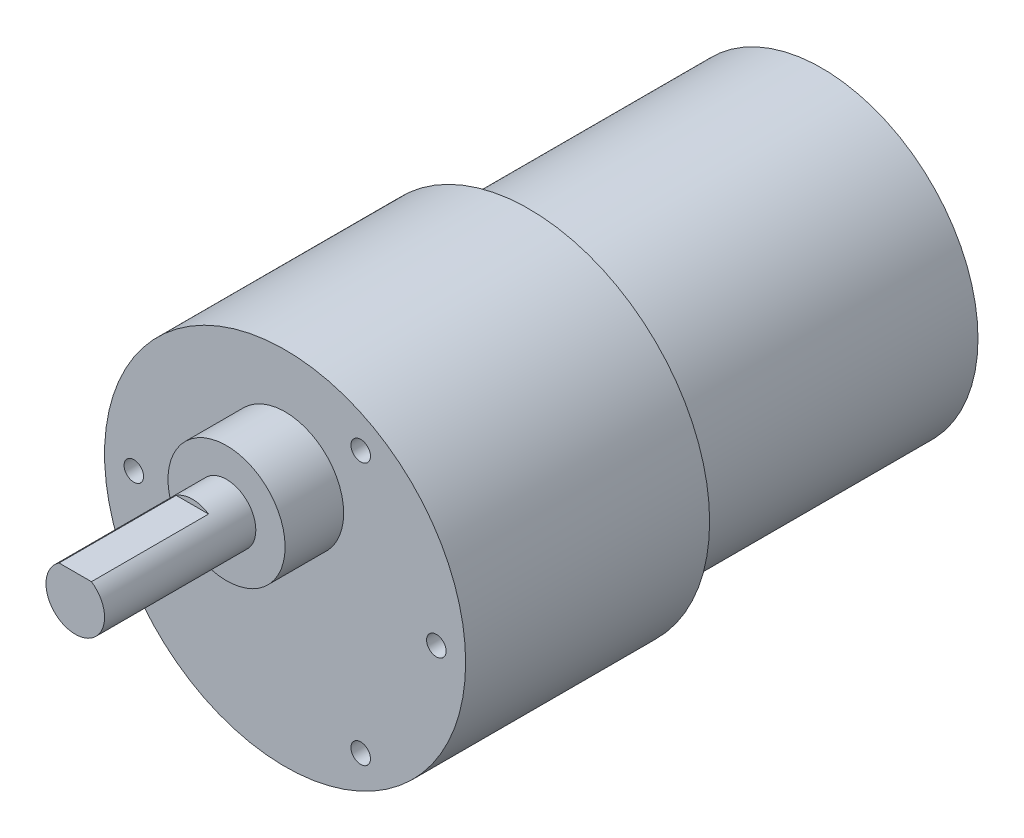
ISO-10303-21;
HEADER;
FILE_DESCRIPTION(('STEP AP214'),'2;1');
FILE_NAME('part.step','',(''),(''),'','','');
FILE_SCHEMA(('AUTOMOTIVE_DESIGN { 1 0 10303 214 1 1 1 1 }'));
ENDSEC;
DATA;
#1=APPLICATION_CONTEXT('core data for automotive mechanical design processes');
#2=APPLICATION_PROTOCOL_DEFINITION('international standard','automotive_design',2000,#1);
#3=PRODUCT_CONTEXT('',#1,'mechanical');
#4=PRODUCT('Part','Part','',(#3));
#5=PRODUCT_RELATED_PRODUCT_CATEGORY('part','',(#4));
#6=PRODUCT_DEFINITION_FORMATION('','',#4);
#7=PRODUCT_DEFINITION_CONTEXT('part definition',#1,'design');
#8=PRODUCT_DEFINITION('design','',#6,#7);
#9=PRODUCT_DEFINITION_SHAPE('','',#8);
#10=(LENGTH_UNIT() NAMED_UNIT(*) SI_UNIT(.MILLI.,.METRE.));
#11=(NAMED_UNIT(*) PLANE_ANGLE_UNIT() SI_UNIT($,.RADIAN.));
#12=(NAMED_UNIT(*) SI_UNIT($,.STERADIAN.) SOLID_ANGLE_UNIT());
#13=UNCERTAINTY_MEASURE_WITH_UNIT(LENGTH_MEASURE(1.E-05),#10,'distance_accuracy_value','');
#14=(GEOMETRIC_REPRESENTATION_CONTEXT(3) GLOBAL_UNCERTAINTY_ASSIGNED_CONTEXT((#13)) GLOBAL_UNIT_ASSIGNED_CONTEXT((#10,
#11,#12)) REPRESENTATION_CONTEXT('',''));
#15=CARTESIAN_POINT('',(0.,0.,0.));
#16=DIRECTION('',(0.,0.,1.));
#17=DIRECTION('',(1.,0.,0.));
#18=AXIS2_PLACEMENT_3D('',#15,#16,#17);
#19=CARTESIAN_POINT('',(0.,7.,61.));
#20=DIRECTION('',(0.,0.,1.));
#21=DIRECTION('',(1.,0.,0.));
#22=AXIS2_PLACEMENT_3D('',#19,#20,#21);
#23=PLANE('',#22);
#24=CARTESIAN_POINT('',(0.,7.,61.));
#25=DIRECTION('',(0.,0.,1.));
#26=DIRECTION('',(1.,0.,0.));
#27=AXIS2_PLACEMENT_3D('',#24,#25,#26);
#28=CIRCLE('',#27,6.);
#29=CARTESIAN_POINT('',(6.,7.,61.));
#30=VERTEX_POINT('',#29);
#31=EDGE_CURVE('E76',#30,#30,#28,.T.);
#32=ORIENTED_EDGE('',*,*,#31,.T.);
#33=EDGE_LOOP('',(#32));
#34=FACE_BOUND('',#33,.T.);
#35=CARTESIAN_POINT('',(0.,7.,61.));
#36=DIRECTION('',(0.,0.,1.));
#37=DIRECTION('',(1.,0.,0.));
#38=AXIS2_PLACEMENT_3D('',#35,#36,#37);
#39=CIRCLE('',#38,3.);
#40=CARTESIAN_POINT('',(3.,7.,61.));
#41=VERTEX_POINT('',#40);
#42=EDGE_CURVE('E73',#41,#41,#39,.T.);
#43=ORIENTED_EDGE('',*,*,#42,.F.);
#44=EDGE_LOOP('',(#43));
#45=FACE_BOUND('',#44,.T.);
#46=ADVANCED_FACE('F34',(#34,#45),#23,.T.);
#47=CARTESIAN_POINT('',(0.,0.,55.));
#48=DIRECTION('',(0.,0.,1.));
#49=DIRECTION('',(1.,0.,0.));
#50=AXIS2_PLACEMENT_3D('',#47,#48,#49);
#51=PLANE('',#50);
#52=CARTESIAN_POINT('',(0.,0.,55.));
#53=DIRECTION('',(0.,0.,1.));
#54=DIRECTION('',(1.,0.,0.));
#55=AXIS2_PLACEMENT_3D('',#52,#53,#54);
#56=CIRCLE('',#55,18.5);
#57=CARTESIAN_POINT('',(18.5,0.,55.));
#58=VERTEX_POINT('',#57);
#59=EDGE_CURVE('E109',#58,#58,#56,.T.);
#60=ORIENTED_EDGE('',*,*,#59,.T.);
#61=EDGE_LOOP('',(#60));
#62=FACE_BOUND('',#61,.T.);
#63=CARTESIAN_POINT('',(-15.5,1.08235921504137E-13,55.));
#64=DIRECTION('',(0.,0.,1.));
#65=DIRECTION('',(-1.,0.,0.));
#66=AXIS2_PLACEMENT_3D('',#63,#64,#65);
#67=CIRCLE('',#66,0.999999999999476);
#68=CARTESIAN_POINT('',(-16.4999999999995,1.08235921504137E-13,55.));
#69=VERTEX_POINT('',#68);
#70=EDGE_CURVE('E100',#69,#69,#67,.T.);
#71=ORIENTED_EDGE('',*,*,#70,.F.);
#72=EDGE_LOOP('',(#71));
#73=FACE_BOUND('',#72,.T.);
#74=CARTESIAN_POINT('',(7.75000000000029,-13.423393758659,55.));
#75=DIRECTION('',(0.,0.,1.));
#76=DIRECTION('',(-1.,0.,0.));
#77=AXIS2_PLACEMENT_3D('',#74,#75,#76);
#78=CIRCLE('',#77,1.00000000000001);
#79=CARTESIAN_POINT('',(6.75000000000028,-13.423393758659,55.));
#80=VERTEX_POINT('',#79);
#81=EDGE_CURVE('E94',#80,#80,#78,.T.);
#82=ORIENTED_EDGE('',*,*,#81,.F.);
#83=EDGE_LOOP('',(#82));
#84=FACE_BOUND('',#83,.T.);
#85=CARTESIAN_POINT('',(15.5,0.,55.));
#86=DIRECTION('',(0.,0.,1.));
#87=DIRECTION('',(-1.,0.,0.));
#88=AXIS2_PLACEMENT_3D('',#85,#86,#87);
#89=CIRCLE('',#88,1.00000000000076);
#90=CARTESIAN_POINT('',(14.4999999999992,0.,55.));
#91=VERTEX_POINT('',#90);
#92=EDGE_CURVE('E88',#91,#91,#89,.T.);
#93=ORIENTED_EDGE('',*,*,#92,.F.);
#94=EDGE_LOOP('',(#93));
#95=FACE_BOUND('',#94,.T.);
#96=CARTESIAN_POINT('',(7.74999999999994,13.4233937586588,55.));
#97=DIRECTION('',(0.,0.,1.));
#98=DIRECTION('',(-1.,0.,0.));
#99=AXIS2_PLACEMENT_3D('',#96,#97,#98);
#100=CIRCLE('',#99,1.00000000000061);
#101=CARTESIAN_POINT('',(6.74999999999933,13.4233937586588,55.));
#102=VERTEX_POINT('',#101);
#103=EDGE_CURVE('E83',#102,#102,#100,.T.);
#104=ORIENTED_EDGE('',*,*,#103,.F.);
#105=EDGE_LOOP('',(#104));
#106=FACE_BOUND('',#105,.T.);
#107=CARTESIAN_POINT('',(0.,7.,55.));
#108=DIRECTION('',(0.,0.,1.));
#109=DIRECTION('',(1.,0.,0.));
#110=AXIS2_PLACEMENT_3D('',#107,#108,#109);
#111=CIRCLE('',#110,6.);
#112=CARTESIAN_POINT('',(6.,7.,55.));
#113=VERTEX_POINT('',#112);
#114=EDGE_CURVE('E72',#113,#113,#111,.T.);
#115=ORIENTED_EDGE('',*,*,#114,.F.);
#116=EDGE_LOOP('',(#115));
#117=FACE_BOUND('',#116,.T.);
#118=ADVANCED_FACE('F131',(#62,#73,#84,#95,#106,#117),#51,.T.);
#119=CARTESIAN_POINT('',(0.,0.,30.));
#120=DIRECTION('',(0.,0.,-1.));
#121=DIRECTION('',(-1.,0.,0.));
#122=AXIS2_PLACEMENT_3D('',#119,#120,#121);
#123=CYLINDRICAL_SURFACE('',#122,16.);
#124=CARTESIAN_POINT('',(0.,0.,30.));
#125=DIRECTION('',(0.,0.,1.));
#126=DIRECTION('',(1.,0.,0.));
#127=AXIS2_PLACEMENT_3D('',#124,#125,#126);
#128=CIRCLE('',#127,16.);
#129=CARTESIAN_POINT('',(16.,0.,30.));
#130=VERTEX_POINT('',#129);
#131=EDGE_CURVE('E63',#130,#130,#128,.T.);
#132=ORIENTED_EDGE('',*,*,#131,.F.);
#133=EDGE_LOOP('',(#132));
#134=FACE_BOUND('',#133,.T.);
#135=CARTESIAN_POINT('',(0.,0.,0.));
#136=DIRECTION('',(0.,0.,1.));
#137=DIRECTION('',(1.,0.,0.));
#138=AXIS2_PLACEMENT_3D('',#135,#136,#137);
#139=CIRCLE('',#138,16.);
#140=CARTESIAN_POINT('',(16.,0.,0.));
#141=VERTEX_POINT('',#140);
#142=EDGE_CURVE('E112',#141,#141,#139,.T.);
#143=ORIENTED_EDGE('',*,*,#142,.T.);
#144=EDGE_LOOP('',(#143));
#145=FACE_BOUND('',#144,.T.);
#146=ADVANCED_FACE('F36',(#134,#145),#123,.T.);
#147=CARTESIAN_POINT('',(0.,0.,0.));
#148=DIRECTION('',(0.,0.,1.));
#149=DIRECTION('',(1.,0.,0.));
#150=AXIS2_PLACEMENT_3D('',#147,#148,#149);
#151=PLANE('',#150);
#152=ORIENTED_EDGE('',*,*,#142,.F.);
#153=EDGE_LOOP('',(#152));
#154=FACE_BOUND('',#153,.T.);
#155=ADVANCED_FACE('F121',(#154),#151,.F.);
#156=CARTESIAN_POINT('',(0.,0.,30.));
#157=DIRECTION('',(0.,0.,1.));
#158=DIRECTION('',(1.,0.,0.));
#159=AXIS2_PLACEMENT_3D('',#156,#157,#158);
#160=PLANE('',#159);
#161=CARTESIAN_POINT('',(0.,0.,30.));
#162=DIRECTION('',(0.,0.,1.));
#163=DIRECTION('',(1.,0.,0.));
#164=AXIS2_PLACEMENT_3D('',#161,#162,#163);
#165=CIRCLE('',#164,18.5);
#166=CARTESIAN_POINT('',(18.5,0.,30.));
#167=VERTEX_POINT('',#166);
#168=EDGE_CURVE('E106',#167,#167,#165,.T.);
#169=ORIENTED_EDGE('',*,*,#168,.F.);
#170=EDGE_LOOP('',(#169));
#171=FACE_BOUND('',#170,.T.);
#172=ORIENTED_EDGE('',*,*,#131,.T.);
#173=EDGE_LOOP('',(#172));
#174=FACE_BOUND('',#173,.T.);
#175=ADVANCED_FACE('F123',(#171,#174),#160,.F.);
#176=CARTESIAN_POINT('',(0.,0.,55.));
#177=DIRECTION('',(0.,0.,-1.));
#178=DIRECTION('',(-1.,0.,0.));
#179=AXIS2_PLACEMENT_3D('',#176,#177,#178);
#180=CYLINDRICAL_SURFACE('',#179,18.5);
#181=ORIENTED_EDGE('',*,*,#59,.F.);
#182=EDGE_LOOP('',(#181));
#183=FACE_BOUND('',#182,.T.);
#184=ORIENTED_EDGE('',*,*,#168,.T.);
#185=EDGE_LOOP('',(#184));
#186=FACE_BOUND('',#185,.T.);
#187=ADVANCED_FACE('F128',(#183,#186),#180,.T.);
#188=CARTESIAN_POINT('',(-15.5,1.08235921504137E-13,51.5));
#189=DIRECTION('',(0.,0.,1.));
#190=DIRECTION('',(1.,0.,0.));
#191=AXIS2_PLACEMENT_3D('',#188,#189,#190);
#192=CYLINDRICAL_SURFACE('',#191,0.999999999999476);
#193=CARTESIAN_POINT('',(-15.5,1.08235921504137E-13,51.5));
#194=DIRECTION('',(0.,0.,1.));
#195=DIRECTION('',(-1.,0.,0.));
#196=AXIS2_PLACEMENT_3D('',#193,#194,#195);
#197=CIRCLE('',#196,0.999999999999476);
#198=CARTESIAN_POINT('',(-16.4999999999995,1.08235921504137E-13,51.5));
#199=VERTEX_POINT('',#198);
#200=EDGE_CURVE('E103',#199,#199,#197,.T.);
#201=ORIENTED_EDGE('',*,*,#200,.F.);
#202=EDGE_LOOP('',(#201));
#203=FACE_BOUND('',#202,.T.);
#204=ORIENTED_EDGE('',*,*,#70,.T.);
#205=EDGE_LOOP('',(#204));
#206=FACE_BOUND('',#205,.T.);
#207=ADVANCED_FACE('F177',(#203,#206),#192,.F.);
#208=CARTESIAN_POINT('',(-15.5,1.08235921504137E-13,51.5));
#209=DIRECTION('',(0.,0.,-1.));
#210=DIRECTION('',(-1.,0.,0.));
#211=AXIS2_PLACEMENT_3D('',#208,#209,#210);
#212=PLANE('',#211);
#213=ORIENTED_EDGE('',*,*,#200,.T.);
#214=EDGE_LOOP('',(#213));
#215=FACE_BOUND('',#214,.T.);
#216=ADVANCED_FACE('F173',(#215),#212,.F.);
#217=CARTESIAN_POINT('',(7.75000000000029,-13.423393758659,51.5));
#218=DIRECTION('',(0.,0.,1.));
#219=DIRECTION('',(1.,0.,0.));
#220=AXIS2_PLACEMENT_3D('',#217,#218,#219);
#221=CYLINDRICAL_SURFACE('',#220,1.00000000000001);
#222=CARTESIAN_POINT('',(7.75000000000029,-13.423393758659,51.5));
#223=DIRECTION('',(0.,0.,1.));
#224=DIRECTION('',(-1.,0.,0.));
#225=AXIS2_PLACEMENT_3D('',#222,#223,#224);
#226=CIRCLE('',#225,1.00000000000001);
#227=CARTESIAN_POINT('',(6.75000000000028,-13.423393758659,51.5));
#228=VERTEX_POINT('',#227);
#229=EDGE_CURVE('E97',#228,#228,#226,.T.);
#230=ORIENTED_EDGE('',*,*,#229,.F.);
#231=EDGE_LOOP('',(#230));
#232=FACE_BOUND('',#231,.T.);
#233=ORIENTED_EDGE('',*,*,#81,.T.);
#234=EDGE_LOOP('',(#233));
#235=FACE_BOUND('',#234,.T.);
#236=ADVANCED_FACE('F169',(#232,#235),#221,.F.);
#237=CARTESIAN_POINT('',(7.75000000000029,-13.423393758659,51.5));
#238=DIRECTION('',(0.,0.,-1.));
#239=DIRECTION('',(-1.,0.,0.));
#240=AXIS2_PLACEMENT_3D('',#237,#238,#239);
#241=PLANE('',#240);
#242=ORIENTED_EDGE('',*,*,#229,.T.);
#243=EDGE_LOOP('',(#242));
#244=FACE_BOUND('',#243,.T.);
#245=ADVANCED_FACE('F165',(#244),#241,.F.);
#246=CARTESIAN_POINT('',(15.5,0.,51.5));
#247=DIRECTION('',(0.,0.,1.));
#248=DIRECTION('',(1.,0.,0.));
#249=AXIS2_PLACEMENT_3D('',#246,#247,#248);
#250=CYLINDRICAL_SURFACE('',#249,1.00000000000076);
#251=CARTESIAN_POINT('',(15.5,0.,51.5));
#252=DIRECTION('',(0.,0.,1.));
#253=DIRECTION('',(-1.,0.,0.));
#254=AXIS2_PLACEMENT_3D('',#251,#252,#253);
#255=CIRCLE('',#254,1.00000000000076);
#256=CARTESIAN_POINT('',(14.4999999999992,0.,51.5));
#257=VERTEX_POINT('',#256);
#258=EDGE_CURVE('E91',#257,#257,#255,.T.);
#259=ORIENTED_EDGE('',*,*,#258,.F.);
#260=EDGE_LOOP('',(#259));
#261=FACE_BOUND('',#260,.T.);
#262=ORIENTED_EDGE('',*,*,#92,.T.);
#263=EDGE_LOOP('',(#262));
#264=FACE_BOUND('',#263,.T.);
#265=ADVANCED_FACE('F161',(#261,#264),#250,.F.);
#266=CARTESIAN_POINT('',(15.5,0.,51.5));
#267=DIRECTION('',(0.,0.,-1.));
#268=DIRECTION('',(-1.,0.,0.));
#269=AXIS2_PLACEMENT_3D('',#266,#267,#268);
#270=PLANE('',#269);
#271=ORIENTED_EDGE('',*,*,#258,.T.);
#272=EDGE_LOOP('',(#271));
#273=FACE_BOUND('',#272,.T.);
#274=ADVANCED_FACE('F157',(#273),#270,.F.);
#275=CARTESIAN_POINT('',(7.74999999999994,13.4233937586588,51.5));
#276=DIRECTION('',(0.,0.,1.));
#277=DIRECTION('',(1.,0.,0.));
#278=AXIS2_PLACEMENT_3D('',#275,#276,#277);
#279=CYLINDRICAL_SURFACE('',#278,1.00000000000061);
#280=CARTESIAN_POINT('',(7.74999999999994,13.4233937586588,51.5));
#281=DIRECTION('',(0.,0.,1.));
#282=DIRECTION('',(-1.,0.,0.));
#283=AXIS2_PLACEMENT_3D('',#280,#281,#282);
#284=CIRCLE('',#283,1.00000000000061);
#285=CARTESIAN_POINT('',(6.74999999999933,13.4233937586588,51.5));
#286=VERTEX_POINT('',#285);
#287=EDGE_CURVE('E85',#286,#286,#284,.T.);
#288=ORIENTED_EDGE('',*,*,#287,.F.);
#289=EDGE_LOOP('',(#288));
#290=FACE_BOUND('',#289,.T.);
#291=ORIENTED_EDGE('',*,*,#103,.T.);
#292=EDGE_LOOP('',(#291));
#293=FACE_BOUND('',#292,.T.);
#294=ADVANCED_FACE('F153',(#290,#293),#279,.F.);
#295=CARTESIAN_POINT('',(7.74999999999994,13.4233937586588,51.5));
#296=DIRECTION('',(0.,0.,-1.));
#297=DIRECTION('',(-1.,0.,0.));
#298=AXIS2_PLACEMENT_3D('',#295,#296,#297);
#299=PLANE('',#298);
#300=ORIENTED_EDGE('',*,*,#287,.T.);
#301=EDGE_LOOP('',(#300));
#302=FACE_BOUND('',#301,.T.);
#303=ADVANCED_FACE('F149',(#302),#299,.F.);
#304=CARTESIAN_POINT('',(0.,7.,61.));
#305=DIRECTION('',(0.,0.,-1.));
#306=DIRECTION('',(-1.,0.,0.));
#307=AXIS2_PLACEMENT_3D('',#304,#305,#306);
#308=CYLINDRICAL_SURFACE('',#307,6.);
#309=ORIENTED_EDGE('',*,*,#31,.F.);
#310=EDGE_LOOP('',(#309));
#311=FACE_BOUND('',#310,.T.);
#312=ORIENTED_EDGE('',*,*,#114,.T.);
#313=EDGE_LOOP('',(#312));
#314=FACE_BOUND('',#313,.T.);
#315=ADVANCED_FACE('F146',(#311,#314),#308,.T.);
#316=CARTESIAN_POINT('',(0.,7.,76.5));
#317=DIRECTION('',(0.,0.,-1.));
#318=DIRECTION('',(-1.,0.,0.));
#319=AXIS2_PLACEMENT_3D('',#316,#317,#318);
#320=CYLINDRICAL_SURFACE('',#319,3.);
#321=CARTESIAN_POINT('',(0.,7.,76.5));
#322=DIRECTION('',(0.,0.,1.));
#323=DIRECTION('',(1.,0.,0.));
#324=AXIS2_PLACEMENT_3D('',#321,#322,#323);
#325=CIRCLE('',#324,3.);
#326=CARTESIAN_POINT('',(-1.6583123951777,9.5,76.5));
#327=VERTEX_POINT('',#326);
#328=CARTESIAN_POINT('',(1.6583123951777,9.5,76.5));
#329=VERTEX_POINT('',#328);
#330=EDGE_CURVE('E68',#327,#329,#325,.T.);
#331=ORIENTED_EDGE('',*,*,#330,.F.);
#332=DIRECTION('',(0.,0.,-1.));
#333=VECTOR('',#332,1.);
#334=CARTESIAN_POINT('',(-1.6583123951777,9.5,76.5));
#335=LINE('',#334,#333);
#336=CARTESIAN_POINT('',(-1.6583123951777,9.5,64.5));
#337=VERTEX_POINT('',#336);
#338=EDGE_CURVE('E49',#327,#337,#335,.T.);
#339=ORIENTED_EDGE('',*,*,#338,.T.);
#340=CARTESIAN_POINT('',(0.,7.,64.5));
#341=DIRECTION('',(0.,0.,1.));
#342=DIRECTION('',(1.,0.,0.));
#343=AXIS2_PLACEMENT_3D('',#340,#341,#342);
#344=CIRCLE('',#343,3.);
#345=CARTESIAN_POINT('',(1.6583123951777,9.5,64.5));
#346=VERTEX_POINT('',#345);
#347=EDGE_CURVE('E11',#346,#337,#344,.T.);
#348=ORIENTED_EDGE('',*,*,#347,.F.);
#349=DIRECTION('',(0.,0.,-1.));
#350=VECTOR('',#349,1.);
#351=CARTESIAN_POINT('',(1.6583123951777,9.5,76.5));
#352=LINE('',#351,#350);
#353=EDGE_CURVE('E54',#346,#329,#352,.F.);
#354=ORIENTED_EDGE('',*,*,#353,.T.);
#355=EDGE_LOOP('',(#331,#339,#348,#354));
#356=FACE_BOUND('',#355,.T.);
#357=ORIENTED_EDGE('',*,*,#42,.T.);
#358=EDGE_LOOP('',(#357));
#359=FACE_BOUND('',#358,.T.);
#360=ADVANCED_FACE('F66',(#356,#359),#320,.T.);
#361=CARTESIAN_POINT('',(0.,7.,76.5));
#362=DIRECTION('',(0.,0.,1.));
#363=DIRECTION('',(1.,0.,0.));
#364=AXIS2_PLACEMENT_3D('',#361,#362,#363);
#365=PLANE('',#364);
#366=DIRECTION('',(1.,0.,0.));
#367=VECTOR('',#366,1.);
#368=CARTESIAN_POINT('',(0.,9.5,76.5));
#369=LINE('',#368,#367);
#370=EDGE_CURVE('E42',#327,#329,#369,.T.);
#371=ORIENTED_EDGE('',*,*,#370,.F.);
#372=ORIENTED_EDGE('',*,*,#330,.T.);
#373=EDGE_LOOP('',(#371,#372));
#374=FACE_BOUND('',#373,.T.);
#375=ADVANCED_FACE('F71',(#374),#365,.T.);
#376=CARTESIAN_POINT('',(0.,0.,64.5));
#377=DIRECTION('',(0.,0.,1.));
#378=DIRECTION('',(1.,0.,0.));
#379=AXIS2_PLACEMENT_3D('',#376,#377,#378);
#380=PLANE('',#379);
#381=ORIENTED_EDGE('',*,*,#347,.T.);
#382=DIRECTION('',(1.,0.,0.));
#383=VECTOR('',#382,1.);
#384=CARTESIAN_POINT('',(-3.65432323431856,9.5,64.5));
#385=LINE('',#384,#383);
#386=EDGE_CURVE('E69',#337,#346,#385,.T.);
#387=ORIENTED_EDGE('',*,*,#386,.T.);
#388=EDGE_LOOP('',(#381,#387));
#389=FACE_BOUND('',#388,.T.);
#390=ADVANCED_FACE('F255',(#389),#380,.T.);
#391=CARTESIAN_POINT('',(-3.65432323431856,9.5,64.5));
#392=DIRECTION('',(0.,-1.,0.));
#393=DIRECTION('',(0.,0.,-1.));
#394=AXIS2_PLACEMENT_3D('',#391,#392,#393);
#395=PLANE('',#394);
#396=ORIENTED_EDGE('',*,*,#370,.T.);
#397=ORIENTED_EDGE('',*,*,#353,.F.);
#398=ORIENTED_EDGE('',*,*,#386,.F.);
#399=ORIENTED_EDGE('',*,*,#338,.F.);
#400=EDGE_LOOP('',(#396,#397,#398,#399));
#401=FACE_BOUND('',#400,.T.);
#402=ADVANCED_FACE('F59',(#401),#395,.F.);
#403=CLOSED_SHELL('',(#46,#118,#146,#155,#175,#187,#207,#216,#236,#245,#265,#274,#294,#303,#315,
#360,#375,#390,#402));
#404=MANIFOLD_SOLID_BREP('B2',#403);
#405=ADVANCED_BREP_SHAPE_REPRESENTATION('',(#18,#404),#14);
#406=SHAPE_DEFINITION_REPRESENTATION(#9,#405);
ENDSEC;
END-ISO-10303-21;
